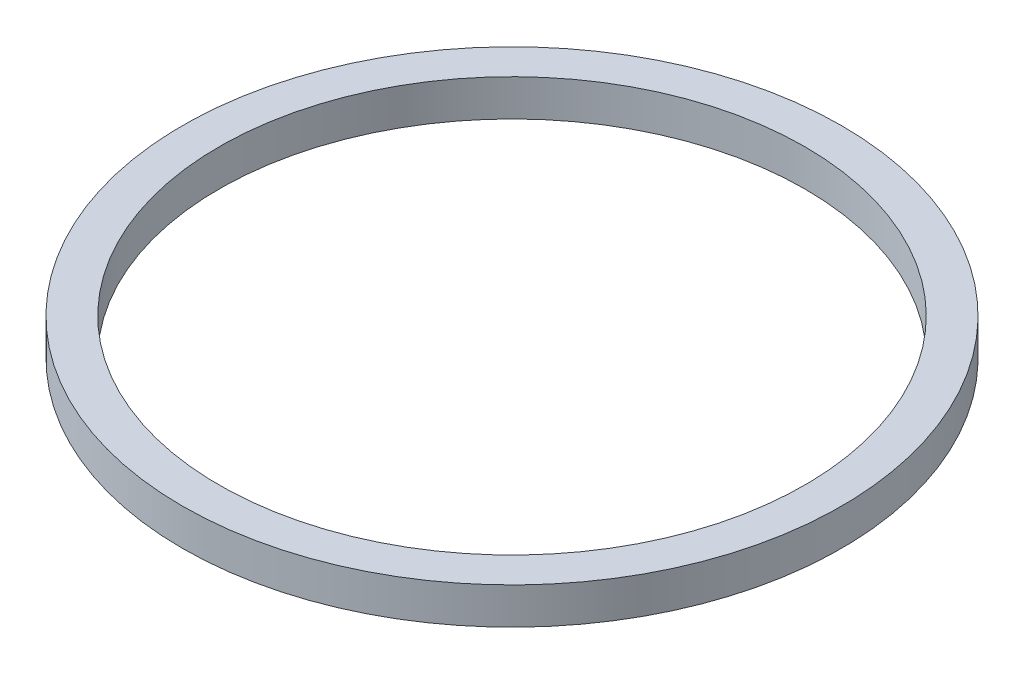
ISO-10303-21;
HEADER;
FILE_DESCRIPTION(('STEP AP214'),'2;1');
FILE_NAME('part.step','',(''),(''),'','','');
FILE_SCHEMA(('AUTOMOTIVE_DESIGN { 1 0 10303 214 1 1 1 1 }'));
ENDSEC;
DATA;
#1=APPLICATION_CONTEXT('core data for automotive mechanical design processes');
#2=APPLICATION_PROTOCOL_DEFINITION('international standard','automotive_design',2000,#1);
#3=PRODUCT_CONTEXT('',#1,'mechanical');
#4=PRODUCT('Part','Part','',(#3));
#5=PRODUCT_RELATED_PRODUCT_CATEGORY('part','',(#4));
#6=PRODUCT_DEFINITION_FORMATION('','',#4);
#7=PRODUCT_DEFINITION_CONTEXT('part definition',#1,'design');
#8=PRODUCT_DEFINITION('design','',#6,#7);
#9=PRODUCT_DEFINITION_SHAPE('','',#8);
#10=(LENGTH_UNIT() NAMED_UNIT(*) SI_UNIT(.MILLI.,.METRE.));
#11=(NAMED_UNIT(*) PLANE_ANGLE_UNIT() SI_UNIT($,.RADIAN.));
#12=(NAMED_UNIT(*) SI_UNIT($,.STERADIAN.) SOLID_ANGLE_UNIT());
#13=UNCERTAINTY_MEASURE_WITH_UNIT(LENGTH_MEASURE(1.E-05),#10,'distance_accuracy_value','');
#14=(GEOMETRIC_REPRESENTATION_CONTEXT(3) GLOBAL_UNCERTAINTY_ASSIGNED_CONTEXT((#13)) GLOBAL_UNIT_ASSIGNED_CONTEXT((#10,
#11,#12)) REPRESENTATION_CONTEXT('',''));
#15=CARTESIAN_POINT('',(0.,0.,0.));
#16=DIRECTION('',(0.,0.,1.));
#17=DIRECTION('',(1.,0.,0.));
#18=AXIS2_PLACEMENT_3D('',#15,#16,#17);
#19=CARTESIAN_POINT('',(0.,19.05,0.));
#20=DIRECTION('',(0.,1.,0.));
#21=DIRECTION('',(0.,0.,1.));
#22=AXIS2_PLACEMENT_3D('',#19,#20,#21);
#23=PLANE('',#22);
#24=CARTESIAN_POINT('',(0.,19.05,0.));
#25=DIRECTION('',(0.,1.,0.));
#26=DIRECTION('',(0.,0.,1.));
#27=AXIS2_PLACEMENT_3D('',#24,#25,#26);
#28=CIRCLE('',#27,171.45);
#29=CARTESIAN_POINT('',(0.,19.05,-171.45));
#30=VERTEX_POINT('',#29);
#31=EDGE_CURVE('E10',#30,#30,#28,.T.);
#32=ORIENTED_EDGE('',*,*,#31,.T.);
#33=EDGE_LOOP('',(#32));
#34=FACE_BOUND('',#33,.T.);
#35=CARTESIAN_POINT('',(0.,19.05,0.));
#36=DIRECTION('',(0.,1.,0.));
#37=DIRECTION('',(0.,0.,1.));
#38=AXIS2_PLACEMENT_3D('',#35,#36,#37);
#39=CIRCLE('',#38,152.4);
#40=CARTESIAN_POINT('',(0.,19.05,-152.4));
#41=VERTEX_POINT('',#40);
#42=EDGE_CURVE('E50',#41,#41,#39,.T.);
#43=ORIENTED_EDGE('',*,*,#42,.F.);
#44=EDGE_LOOP('',(#43));
#45=FACE_BOUND('',#44,.T.);
#46=ADVANCED_FACE('F37',(#34,#45),#23,.T.);
#47=CARTESIAN_POINT('',(0.,0.,0.));
#48=DIRECTION('',(0.,1.,0.));
#49=DIRECTION('',(0.,0.,1.));
#50=AXIS2_PLACEMENT_3D('',#47,#48,#49);
#51=PLANE('',#50);
#52=CARTESIAN_POINT('',(0.,0.,0.));
#53=DIRECTION('',(0.,1.,0.));
#54=DIRECTION('',(0.,0.,1.));
#55=AXIS2_PLACEMENT_3D('',#52,#53,#54);
#56=CIRCLE('',#55,171.45);
#57=CARTESIAN_POINT('',(0.,0.,-171.45));
#58=VERTEX_POINT('',#57);
#59=EDGE_CURVE('E41',#58,#58,#56,.T.);
#60=ORIENTED_EDGE('',*,*,#59,.F.);
#61=EDGE_LOOP('',(#60));
#62=FACE_BOUND('',#61,.T.);
#63=CARTESIAN_POINT('',(0.,0.,0.));
#64=DIRECTION('',(0.,1.,0.));
#65=DIRECTION('',(0.,0.,1.));
#66=AXIS2_PLACEMENT_3D('',#63,#64,#65);
#67=CIRCLE('',#66,152.4);
#68=CARTESIAN_POINT('',(0.,0.,-152.4));
#69=VERTEX_POINT('',#68);
#70=EDGE_CURVE('E52',#69,#69,#67,.T.);
#71=ORIENTED_EDGE('',*,*,#70,.T.);
#72=EDGE_LOOP('',(#71));
#73=FACE_BOUND('',#72,.T.);
#74=ADVANCED_FACE('F64',(#62,#73),#51,.F.);
#75=CARTESIAN_POINT('',(0.,19.05,0.));
#76=DIRECTION('',(0.,-1.,0.));
#77=DIRECTION('',(0.,0.,-1.));
#78=AXIS2_PLACEMENT_3D('',#75,#76,#77);
#79=CYLINDRICAL_SURFACE('',#78,171.45);
#80=CARTESIAN_POINT('',(0.,19.05,-171.45));
#81=CARTESIAN_POINT('',(0.,18.8515625,-171.45));
#82=CARTESIAN_POINT('',(0.,18.653125,-171.45));
#83=CARTESIAN_POINT('',(0.,18.25625,-171.45));
#84=CARTESIAN_POINT('',(0.,18.0578125,-171.45));
#85=CARTESIAN_POINT('',(0.,17.6609375,-171.45));
#86=CARTESIAN_POINT('',(0.,17.4625,-171.45));
#87=CARTESIAN_POINT('',(0.,17.065625,-171.45));
#88=CARTESIAN_POINT('',(0.,16.8671875,-171.45));
#89=CARTESIAN_POINT('',(0.,16.4703125,-171.45));
#90=CARTESIAN_POINT('',(0.,16.271875,-171.45));
#91=CARTESIAN_POINT('',(0.,15.875,-171.45));
#92=CARTESIAN_POINT('',(0.,15.6765625,-171.45));
#93=CARTESIAN_POINT('',(0.,15.2796875,-171.45));
#94=CARTESIAN_POINT('',(0.,15.08125,-171.45));
#95=CARTESIAN_POINT('',(0.,14.684375,-171.45));
#96=CARTESIAN_POINT('',(0.,14.4859375,-171.45));
#97=CARTESIAN_POINT('',(0.,14.0890625,-171.45));
#98=CARTESIAN_POINT('',(0.,13.890625,-171.45));
#99=CARTESIAN_POINT('',(0.,13.49375,-171.45));
#100=CARTESIAN_POINT('',(0.,13.2953125,-171.45));
#101=CARTESIAN_POINT('',(0.,12.8984375,-171.45));
#102=CARTESIAN_POINT('',(0.,12.7,-171.45));
#103=CARTESIAN_POINT('',(0.,12.303125,-171.45));
#104=CARTESIAN_POINT('',(0.,12.1046875,-171.45));
#105=CARTESIAN_POINT('',(0.,11.7078125,-171.45));
#106=CARTESIAN_POINT('',(0.,11.509375,-171.45));
#107=CARTESIAN_POINT('',(0.,11.1125,-171.45));
#108=CARTESIAN_POINT('',(0.,10.9140625,-171.45));
#109=CARTESIAN_POINT('',(0.,10.5171875,-171.45));
#110=CARTESIAN_POINT('',(0.,10.31875,-171.45));
#111=CARTESIAN_POINT('',(0.,9.921875,-171.45));
#112=CARTESIAN_POINT('',(0.,9.7234375,-171.45));
#113=CARTESIAN_POINT('',(0.,9.3265625,-171.45));
#114=CARTESIAN_POINT('',(0.,9.128125,-171.45));
#115=CARTESIAN_POINT('',(0.,8.73125,-171.45));
#116=CARTESIAN_POINT('',(0.,8.5328125,-171.45));
#117=CARTESIAN_POINT('',(0.,8.1359375,-171.45));
#118=CARTESIAN_POINT('',(0.,7.9375,-171.45));
#119=CARTESIAN_POINT('',(0.,7.540625,-171.45));
#120=CARTESIAN_POINT('',(0.,7.3421875,-171.45));
#121=CARTESIAN_POINT('',(0.,6.9453125,-171.45));
#122=CARTESIAN_POINT('',(0.,6.746875,-171.45));
#123=CARTESIAN_POINT('',(0.,6.35,-171.45));
#124=CARTESIAN_POINT('',(0.,6.1515625,-171.45));
#125=CARTESIAN_POINT('',(0.,5.7546875,-171.45));
#126=CARTESIAN_POINT('',(0.,5.55625,-171.45));
#127=CARTESIAN_POINT('',(0.,5.159375,-171.45));
#128=CARTESIAN_POINT('',(0.,4.9609375,-171.45));
#129=CARTESIAN_POINT('',(0.,4.5640625,-171.45));
#130=CARTESIAN_POINT('',(0.,4.365625,-171.45));
#131=CARTESIAN_POINT('',(0.,3.96875,-171.45));
#132=CARTESIAN_POINT('',(0.,3.7703125,-171.45));
#133=CARTESIAN_POINT('',(0.,3.3734375,-171.45));
#134=CARTESIAN_POINT('',(0.,3.175,-171.45));
#135=CARTESIAN_POINT('',(0.,2.778125,-171.45));
#136=CARTESIAN_POINT('',(0.,2.5796875,-171.45));
#137=CARTESIAN_POINT('',(0.,2.1828125,-171.45));
#138=CARTESIAN_POINT('',(0.,1.984375,-171.45));
#139=CARTESIAN_POINT('',(0.,1.5875,-171.45));
#140=CARTESIAN_POINT('',(0.,1.3890625,-171.45));
#141=CARTESIAN_POINT('',(0.,0.992187500000001,-171.45));
#142=CARTESIAN_POINT('',(0.,0.793750000000001,-171.45));
#143=CARTESIAN_POINT('',(0.,0.396875,-171.45));
#144=CARTESIAN_POINT('',(0.,0.1984375,-171.45));
#145=CARTESIAN_POINT('',(0.,0.,-171.45));
#146=B_SPLINE_CURVE_WITH_KNOTS('',3,(#80,#81,#82,#83,#84,#85,#86,#87,#88,#89,#90,#91,#92,#93,
#94,#95,#96,#97,#98,#99,#100,#101,#102,#103,#104,#105,#106,#107,#108,#109,#110,#111,#112,#113,
#114,#115,#116,#117,#118,#119,#120,#121,#122,#123,#124,#125,#126,#127,#128,#129,#130,#131,#132,
#133,#134,#135,#136,#137,#138,#139,#140,#141,#142,#143,#144,#145),.UNSPECIFIED.,.F.,.F.,(4,2,2,
2,2,2,2,2,2,2,2,2,2,2,2,2,2,2,2,2,2,2,2,2,2,2,2,2,2,2,2,2,4),(0.,0.5953125,1.190625,1.7859375,
2.38125,2.9765625,3.571875,4.1671875,4.7625,5.3578125,5.953125,6.5484375,7.14375,7.7390625,
8.334375,8.9296875,9.525,10.1203125,10.715625,11.3109375,11.90625,12.5015625,13.096875,
13.6921875,14.2875,14.8828125,15.478125,16.0734375,16.66875,17.2640625,17.859375,18.4546875,
19.05),.UNSPECIFIED.);
#147=EDGE_CURVE('BSEAM39',#30,#58,#146,.T.);
#148=ORIENTED_EDGE('',*,*,#31,.F.);
#149=ORIENTED_EDGE('',*,*,#59,.T.);
#150=ORIENTED_EDGE('',*,*,#147,.T.);
#151=ORIENTED_EDGE('',*,*,#147,.F.);
#152=EDGE_LOOP('',(#148,#150,#149,#151));
#153=FACE_BOUND('',#152,.T.);
#154=ADVANCED_FACE('F39',(#153),#79,.T.);
#155=CARTESIAN_POINT('',(0.,19.05,0.));
#156=DIRECTION('',(0.,-1.,0.));
#157=DIRECTION('',(0.,0.,-1.));
#158=AXIS2_PLACEMENT_3D('',#155,#156,#157);
#159=CYLINDRICAL_SURFACE('',#158,152.4);
#160=CARTESIAN_POINT('',(0.,19.05,-152.4));
#161=CARTESIAN_POINT('',(0.,18.8515625,-152.4));
#162=CARTESIAN_POINT('',(0.,18.653125,-152.4));
#163=CARTESIAN_POINT('',(0.,18.25625,-152.4));
#164=CARTESIAN_POINT('',(0.,18.0578125,-152.4));
#165=CARTESIAN_POINT('',(0.,17.6609375,-152.4));
#166=CARTESIAN_POINT('',(0.,17.4625,-152.4));
#167=CARTESIAN_POINT('',(0.,17.065625,-152.4));
#168=CARTESIAN_POINT('',(0.,16.8671875,-152.4));
#169=CARTESIAN_POINT('',(0.,16.4703125,-152.4));
#170=CARTESIAN_POINT('',(0.,16.271875,-152.4));
#171=CARTESIAN_POINT('',(0.,15.875,-152.4));
#172=CARTESIAN_POINT('',(0.,15.6765625,-152.4));
#173=CARTESIAN_POINT('',(0.,15.2796875,-152.4));
#174=CARTESIAN_POINT('',(0.,15.08125,-152.4));
#175=CARTESIAN_POINT('',(0.,14.684375,-152.4));
#176=CARTESIAN_POINT('',(0.,14.4859375,-152.4));
#177=CARTESIAN_POINT('',(0.,14.0890625,-152.4));
#178=CARTESIAN_POINT('',(0.,13.890625,-152.4));
#179=CARTESIAN_POINT('',(0.,13.49375,-152.4));
#180=CARTESIAN_POINT('',(0.,13.2953125,-152.4));
#181=CARTESIAN_POINT('',(0.,12.8984375,-152.4));
#182=CARTESIAN_POINT('',(0.,12.7,-152.4));
#183=CARTESIAN_POINT('',(0.,12.303125,-152.4));
#184=CARTESIAN_POINT('',(0.,12.1046875,-152.4));
#185=CARTESIAN_POINT('',(0.,11.7078125,-152.4));
#186=CARTESIAN_POINT('',(0.,11.509375,-152.4));
#187=CARTESIAN_POINT('',(0.,11.1125,-152.4));
#188=CARTESIAN_POINT('',(0.,10.9140625,-152.4));
#189=CARTESIAN_POINT('',(0.,10.5171875,-152.4));
#190=CARTESIAN_POINT('',(0.,10.31875,-152.4));
#191=CARTESIAN_POINT('',(0.,9.921875,-152.4));
#192=CARTESIAN_POINT('',(0.,9.7234375,-152.4));
#193=CARTESIAN_POINT('',(0.,9.3265625,-152.4));
#194=CARTESIAN_POINT('',(0.,9.128125,-152.4));
#195=CARTESIAN_POINT('',(0.,8.73125,-152.4));
#196=CARTESIAN_POINT('',(0.,8.5328125,-152.4));
#197=CARTESIAN_POINT('',(0.,8.1359375,-152.4));
#198=CARTESIAN_POINT('',(0.,7.9375,-152.4));
#199=CARTESIAN_POINT('',(0.,7.540625,-152.4));
#200=CARTESIAN_POINT('',(0.,7.3421875,-152.4));
#201=CARTESIAN_POINT('',(0.,6.9453125,-152.4));
#202=CARTESIAN_POINT('',(0.,6.746875,-152.4));
#203=CARTESIAN_POINT('',(0.,6.35,-152.4));
#204=CARTESIAN_POINT('',(0.,6.1515625,-152.4));
#205=CARTESIAN_POINT('',(0.,5.7546875,-152.4));
#206=CARTESIAN_POINT('',(0.,5.55625,-152.4));
#207=CARTESIAN_POINT('',(0.,5.159375,-152.4));
#208=CARTESIAN_POINT('',(0.,4.9609375,-152.4));
#209=CARTESIAN_POINT('',(0.,4.5640625,-152.4));
#210=CARTESIAN_POINT('',(0.,4.365625,-152.4));
#211=CARTESIAN_POINT('',(0.,3.96875,-152.4));
#212=CARTESIAN_POINT('',(0.,3.7703125,-152.4));
#213=CARTESIAN_POINT('',(0.,3.3734375,-152.4));
#214=CARTESIAN_POINT('',(0.,3.175,-152.4));
#215=CARTESIAN_POINT('',(0.,2.778125,-152.4));
#216=CARTESIAN_POINT('',(0.,2.5796875,-152.4));
#217=CARTESIAN_POINT('',(0.,2.1828125,-152.4));
#218=CARTESIAN_POINT('',(0.,1.984375,-152.4));
#219=CARTESIAN_POINT('',(0.,1.5875,-152.4));
#220=CARTESIAN_POINT('',(0.,1.3890625,-152.4));
#221=CARTESIAN_POINT('',(0.,0.992187500000001,-152.4));
#222=CARTESIAN_POINT('',(0.,0.793750000000001,-152.4));
#223=CARTESIAN_POINT('',(0.,0.396875,-152.4));
#224=CARTESIAN_POINT('',(0.,0.1984375,-152.4));
#225=CARTESIAN_POINT('',(0.,0.,-152.4));
#226=B_SPLINE_CURVE_WITH_KNOTS('',3,(#160,#161,#162,#163,#164,#165,#166,#167,#168,#169,#170,
#171,#172,#173,#174,#175,#176,#177,#178,#179,#180,#181,#182,#183,#184,#185,#186,#187,#188,#189,
#190,#191,#192,#193,#194,#195,#196,#197,#198,#199,#200,#201,#202,#203,#204,#205,#206,#207,#208,
#209,#210,#211,#212,#213,#214,#215,#216,#217,#218,#219,#220,#221,#222,#223,#224,#225),
.UNSPECIFIED.,.F.,.F.,(4,2,2,2,2,2,2,2,2,2,2,2,2,2,2,2,2,2,2,2,2,2,2,2,2,2,2,2,2,2,2,2,4),(0.,
0.5953125,1.190625,1.7859375,2.38125,2.9765625,3.571875,4.1671875,4.7625,5.3578125,5.953125,
6.5484375,7.14375,7.7390625,8.334375,8.9296875,9.525,10.1203125,10.715625,11.3109375,11.90625,
12.5015625,13.096875,13.6921875,14.2875,14.8828125,15.478125,16.0734375,16.66875,17.2640625,
17.859375,18.4546875,19.05),.UNSPECIFIED.);
#227=EDGE_CURVE('BSEAM60',#41,#69,#226,.T.);
#228=ORIENTED_EDGE('',*,*,#42,.T.);
#229=ORIENTED_EDGE('',*,*,#70,.F.);
#230=ORIENTED_EDGE('',*,*,#227,.T.);
#231=ORIENTED_EDGE('',*,*,#227,.F.);
#232=EDGE_LOOP('',(#228,#230,#229,#231));
#233=FACE_BOUND('',#232,.T.);
#234=ADVANCED_FACE('F60',(#233),#159,.F.);
#235=CLOSED_SHELL('',(#46,#74,#154,#234));
#236=MANIFOLD_SOLID_BREP('B2',#235);
#237=ADVANCED_BREP_SHAPE_REPRESENTATION('',(#18,#236),#14);
#238=SHAPE_DEFINITION_REPRESENTATION(#9,#237);
ENDSEC;
END-ISO-10303-21;
